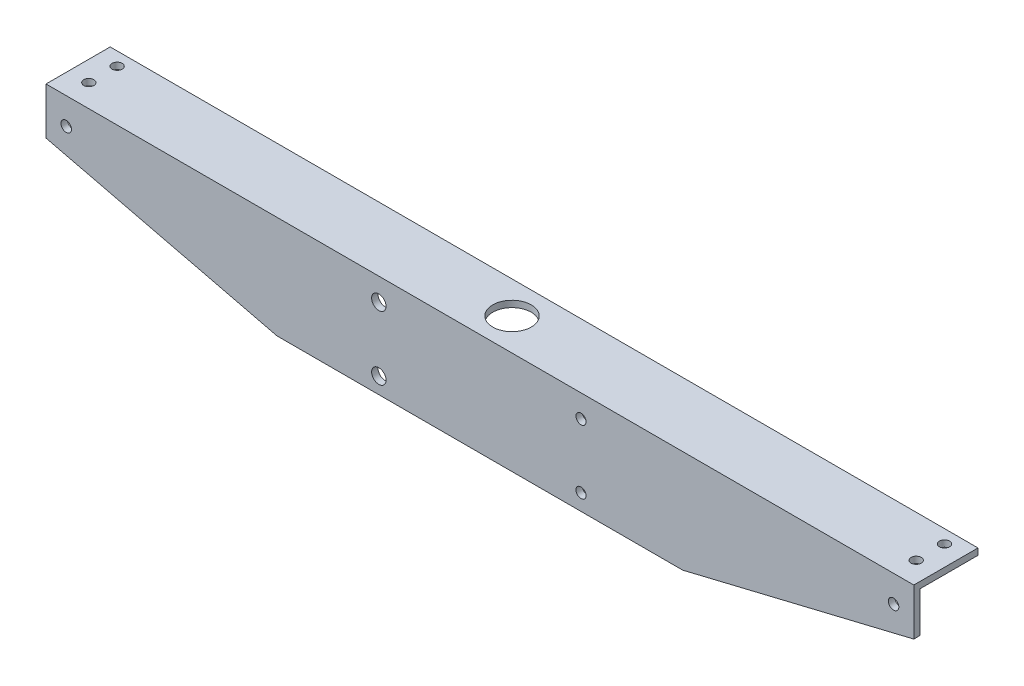
ISO-10303-21;
HEADER;
FILE_DESCRIPTION(('STEP AP214'),'2;1');
FILE_NAME('part.step','',(''),(''),'','','');
FILE_SCHEMA(('AUTOMOTIVE_DESIGN { 1 0 10303 214 1 1 1 1 }'));
ENDSEC;
DATA;
#1=APPLICATION_CONTEXT('core data for automotive mechanical design processes');
#2=APPLICATION_PROTOCOL_DEFINITION('international standard','automotive_design',2000,#1);
#3=PRODUCT_CONTEXT('',#1,'mechanical');
#4=PRODUCT('Part','Part','',(#3));
#5=PRODUCT_RELATED_PRODUCT_CATEGORY('part','',(#4));
#6=PRODUCT_DEFINITION_FORMATION('','',#4);
#7=PRODUCT_DEFINITION_CONTEXT('part definition',#1,'design');
#8=PRODUCT_DEFINITION('design','',#6,#7);
#9=PRODUCT_DEFINITION_SHAPE('','',#8);
#10=(LENGTH_UNIT() NAMED_UNIT(*) SI_UNIT(.MILLI.,.METRE.));
#11=(NAMED_UNIT(*) PLANE_ANGLE_UNIT() SI_UNIT($,.RADIAN.));
#12=(NAMED_UNIT(*) SI_UNIT($,.STERADIAN.) SOLID_ANGLE_UNIT());
#13=UNCERTAINTY_MEASURE_WITH_UNIT(LENGTH_MEASURE(1.E-05),#10,'distance_accuracy_value','');
#14=(GEOMETRIC_REPRESENTATION_CONTEXT(3) GLOBAL_UNCERTAINTY_ASSIGNED_CONTEXT((#13)) GLOBAL_UNIT_ASSIGNED_CONTEXT((#10,
#11,#12)) REPRESENTATION_CONTEXT('',''));
#15=CARTESIAN_POINT('',(0.,0.,0.));
#16=DIRECTION('',(0.,0.,1.));
#17=DIRECTION('',(1.,0.,0.));
#18=AXIS2_PLACEMENT_3D('',#15,#16,#17);
#19=CARTESIAN_POINT('',(214.63,-50.8,0.));
#20=DIRECTION('',(0.,0.,-1.));
#21=DIRECTION('',(-1.,0.,0.));
#22=AXIS2_PLACEMENT_3D('',#19,#20,#21);
#23=PLANE('',#22);
#24=CARTESIAN_POINT('',(-204.63,-13.1750000660001,0.));
#25=DIRECTION('',(0.,0.,1.));
#26=DIRECTION('',(-1.,0.,0.));
#27=AXIS2_PLACEMENT_3D('',#24,#25,#26);
#28=CIRCLE('',#27,2.59999999999999);
#29=CARTESIAN_POINT('',(-207.23,-13.1750000660001,0.));
#30=VERTEX_POINT('',#29);
#31=EDGE_CURVE('E210',#30,#30,#28,.T.);
#32=ORIENTED_EDGE('',*,*,#31,.F.);
#33=EDGE_LOOP('',(#32));
#34=FACE_BOUND('',#33,.T.);
#35=CARTESIAN_POINT('',(204.63,-13.175000066,0.));
#36=DIRECTION('',(0.,0.,1.));
#37=DIRECTION('',(1.,0.,0.));
#38=AXIS2_PLACEMENT_3D('',#35,#36,#37);
#39=CIRCLE('',#38,2.59999999999999);
#40=CARTESIAN_POINT('',(207.23,-13.175000066,0.));
#41=VERTEX_POINT('',#40);
#42=EDGE_CURVE('E214',#41,#41,#39,.T.);
#43=ORIENTED_EDGE('',*,*,#42,.F.);
#44=EDGE_LOOP('',(#43));
#45=FACE_BOUND('',#44,.T.);
#46=CARTESIAN_POINT('',(50.,-42.8,0.));
#47=DIRECTION('',(0.,0.,-1.));
#48=DIRECTION('',(0.,1.,0.));
#49=AXIS2_PLACEMENT_3D('',#46,#47,#48);
#50=CIRCLE('',#49,2.5);
#51=CARTESIAN_POINT('',(50.,-40.3,0.));
#52=VERTEX_POINT('',#51);
#53=EDGE_CURVE('E164',#52,#52,#50,.T.);
#54=ORIENTED_EDGE('',*,*,#53,.T.);
#55=EDGE_LOOP('',(#54));
#56=FACE_BOUND('',#55,.T.);
#57=CARTESIAN_POINT('',(-50.,-42.8,0.));
#58=DIRECTION('',(0.,0.,-1.));
#59=DIRECTION('',(0.,1.,0.));
#60=AXIS2_PLACEMENT_3D('',#57,#58,#59);
#61=CIRCLE('',#60,3.57);
#62=CARTESIAN_POINT('',(-50.,-39.23,0.));
#63=VERTEX_POINT('',#62);
#64=EDGE_CURVE('E172',#63,#63,#61,.T.);
#65=ORIENTED_EDGE('',*,*,#64,.T.);
#66=EDGE_LOOP('',(#65));
#67=FACE_BOUND('',#66,.T.);
#68=CARTESIAN_POINT('',(-50.,-11.175,0.));
#69=DIRECTION('',(0.,0.,-1.));
#70=DIRECTION('',(0.,1.,0.));
#71=AXIS2_PLACEMENT_3D('',#68,#69,#70);
#72=CIRCLE('',#71,3.57);
#73=CARTESIAN_POINT('',(-50.,-7.60500000000001,0.));
#74=VERTEX_POINT('',#73);
#75=EDGE_CURVE('E178',#74,#74,#72,.T.);
#76=ORIENTED_EDGE('',*,*,#75,.T.);
#77=EDGE_LOOP('',(#76));
#78=FACE_BOUND('',#77,.T.);
#79=CARTESIAN_POINT('',(50.,-11.175,0.));
#80=DIRECTION('',(0.,0.,-1.));
#81=DIRECTION('',(0.,1.,0.));
#82=AXIS2_PLACEMENT_3D('',#79,#80,#81);
#83=CIRCLE('',#82,2.5);
#84=CARTESIAN_POINT('',(50.,-8.675,0.));
#85=VERTEX_POINT('',#84);
#86=EDGE_CURVE('E133',#85,#85,#83,.T.);
#87=ORIENTED_EDGE('',*,*,#86,.T.);
#88=EDGE_LOOP('',(#87));
#89=FACE_BOUND('',#88,.T.);
#90=DIRECTION('',(-1.,0.,0.));
#91=VECTOR('',#90,1.);
#92=CARTESIAN_POINT('',(214.63,-50.8,0.));
#93=LINE('',#92,#91);
#94=CARTESIAN_POINT('',(100.33,-50.8,0.));
#95=VERTEX_POINT('',#94);
#96=CARTESIAN_POINT('',(-100.33,-50.8,0.));
#97=VERTEX_POINT('',#96);
#98=EDGE_CURVE('E11',#95,#97,#93,.T.);
#99=ORIENTED_EDGE('',*,*,#98,.F.);
#100=DIRECTION('',(0.972013609099375,0.234924549005864,0.));
#101=VECTOR('',#100,1.);
#102=CARTESIAN_POINT('',(100.33,-50.8,0.));
#103=LINE('',#102,#101);
#104=CARTESIAN_POINT('',(214.63,-23.1750000000001,0.));
#105=VERTEX_POINT('',#104);
#106=EDGE_CURVE('E96',#95,#105,#103,.T.);
#107=ORIENTED_EDGE('',*,*,#106,.T.);
#108=DIRECTION('',(0.,-1.,0.));
#109=VECTOR('',#108,1.);
#110=CARTESIAN_POINT('',(214.63,-50.8,0.));
#111=LINE('',#110,#109);
#112=CARTESIAN_POINT('',(214.63,0.,0.));
#113=VERTEX_POINT('',#112);
#114=EDGE_CURVE('E107',#113,#105,#111,.T.);
#115=ORIENTED_EDGE('',*,*,#114,.F.);
#116=DIRECTION('',(-1.,0.,0.));
#117=VECTOR('',#116,1.);
#118=CARTESIAN_POINT('',(214.63,0.,0.));
#119=LINE('',#118,#117);
#120=CARTESIAN_POINT('',(-214.63,0.,0.));
#121=VERTEX_POINT('',#120);
#122=EDGE_CURVE('E128',#113,#121,#119,.T.);
#123=ORIENTED_EDGE('',*,*,#122,.T.);
#124=DIRECTION('',(0.,-1.,0.));
#125=VECTOR('',#124,1.);
#126=CARTESIAN_POINT('',(-214.63,-50.8,0.));
#127=LINE('',#126,#125);
#128=CARTESIAN_POINT('',(-214.63,-23.175,0.));
#129=VERTEX_POINT('',#128);
#130=EDGE_CURVE('E129',#121,#129,#127,.T.);
#131=ORIENTED_EDGE('',*,*,#130,.T.);
#132=DIRECTION('',(0.972013609099375,-0.234924549005864,0.));
#133=VECTOR('',#132,1.);
#134=CARTESIAN_POINT('',(-100.33,-50.8,0.));
#135=LINE('',#134,#133);
#136=EDGE_CURVE('E54',#129,#97,#135,.T.);
#137=ORIENTED_EDGE('',*,*,#136,.T.);
#138=EDGE_LOOP('',(#99,#107,#115,#123,#131,#137));
#139=FACE_BOUND('',#138,.T.);
#140=ADVANCED_FACE('F32',(#34,#45,#56,#67,#78,#89,#139),#23,.F.);
#141=CARTESIAN_POINT('',(214.63,-50.8,-3.175));
#142=DIRECTION('',(0.,1.,0.));
#143=DIRECTION('',(0.,0.,1.));
#144=AXIS2_PLACEMENT_3D('',#141,#142,#143);
#145=PLANE('',#144);
#146=DIRECTION('',(-1.,0.,0.));
#147=VECTOR('',#146,1.);
#148=CARTESIAN_POINT('',(214.63,-50.8,-3.175));
#149=LINE('',#148,#147);
#150=CARTESIAN_POINT('',(100.33,-50.8,-3.175));
#151=VERTEX_POINT('',#150);
#152=CARTESIAN_POINT('',(-100.33,-50.8,-3.175));
#153=VERTEX_POINT('',#152);
#154=EDGE_CURVE('E39',#151,#153,#149,.T.);
#155=ORIENTED_EDGE('',*,*,#154,.F.);
#156=DIRECTION('',(0.,0.,-1.));
#157=VECTOR('',#156,1.);
#158=CARTESIAN_POINT('',(100.33,-50.8,0.));
#159=LINE('',#158,#157);
#160=EDGE_CURVE('E101',#95,#151,#159,.T.);
#161=ORIENTED_EDGE('',*,*,#160,.F.);
#162=ORIENTED_EDGE('',*,*,#98,.T.);
#163=DIRECTION('',(0.,0.,-1.));
#164=VECTOR('',#163,1.);
#165=CARTESIAN_POINT('',(-100.33,-50.8,0.));
#166=LINE('',#165,#164);
#167=EDGE_CURVE('E157',#97,#153,#166,.T.);
#168=ORIENTED_EDGE('',*,*,#167,.T.);
#169=EDGE_LOOP('',(#155,#161,#162,#168));
#170=FACE_BOUND('',#169,.T.);
#171=ADVANCED_FACE('F160',(#170),#145,.F.);
#172=CARTESIAN_POINT('',(214.63,-3.175,-3.17499999999999));
#173=DIRECTION('',(0.,0.,1.));
#174=DIRECTION('',(0.,-1.,0.));
#175=AXIS2_PLACEMENT_3D('',#172,#173,#174);
#176=PLANE('',#175);
#177=CARTESIAN_POINT('',(-204.63,-13.1750000660001,-3.17499999999999));
#178=DIRECTION('',(0.,0.,1.));
#179=DIRECTION('',(0.,-1.,0.));
#180=AXIS2_PLACEMENT_3D('',#177,#178,#179);
#181=CIRCLE('',#180,2.59999999999999);
#182=CARTESIAN_POINT('',(-204.63,-15.775000066,-3.17499999999999));
#183=VERTEX_POINT('',#182);
#184=EDGE_CURVE('E298',#183,#183,#181,.F.);
#185=ORIENTED_EDGE('',*,*,#184,.F.);
#186=EDGE_LOOP('',(#185));
#187=FACE_BOUND('',#186,.T.);
#188=CARTESIAN_POINT('',(204.63,-13.175000066,-3.17499999999999));
#189=DIRECTION('',(0.,0.,1.));
#190=DIRECTION('',(0.,-1.,0.));
#191=AXIS2_PLACEMENT_3D('',#188,#189,#190);
#192=CIRCLE('',#191,2.59999999999999);
#193=CARTESIAN_POINT('',(204.63,-15.775000066,-3.17499999999999));
#194=VERTEX_POINT('',#193);
#195=EDGE_CURVE('E294',#194,#194,#192,.F.);
#196=ORIENTED_EDGE('',*,*,#195,.F.);
#197=EDGE_LOOP('',(#196));
#198=FACE_BOUND('',#197,.T.);
#199=CARTESIAN_POINT('',(50.,-42.8,-3.175));
#200=DIRECTION('',(0.,0.,-1.));
#201=DIRECTION('',(0.,1.,0.));
#202=AXIS2_PLACEMENT_3D('',#199,#200,#201);
#203=CIRCLE('',#202,2.5);
#204=CARTESIAN_POINT('',(50.,-40.3,-3.175));
#205=VERTEX_POINT('',#204);
#206=EDGE_CURVE('E161',#205,#205,#203,.T.);
#207=ORIENTED_EDGE('',*,*,#206,.F.);
#208=EDGE_LOOP('',(#207));
#209=FACE_BOUND('',#208,.T.);
#210=CARTESIAN_POINT('',(-50.,-42.8,-3.175));
#211=DIRECTION('',(0.,0.,-1.));
#212=DIRECTION('',(0.,1.,0.));
#213=AXIS2_PLACEMENT_3D('',#210,#211,#212);
#214=CIRCLE('',#213,3.57);
#215=CARTESIAN_POINT('',(-50.,-39.23,-3.175));
#216=VERTEX_POINT('',#215);
#217=EDGE_CURVE('E170',#216,#216,#214,.T.);
#218=ORIENTED_EDGE('',*,*,#217,.F.);
#219=EDGE_LOOP('',(#218));
#220=FACE_BOUND('',#219,.T.);
#221=CARTESIAN_POINT('',(-50.,-11.175,-3.17499999999999));
#222=DIRECTION('',(0.,0.,-1.));
#223=DIRECTION('',(0.,1.,0.));
#224=AXIS2_PLACEMENT_3D('',#221,#222,#223);
#225=CIRCLE('',#224,3.57);
#226=CARTESIAN_POINT('',(-50.,-7.60500000000001,-3.17499999999999));
#227=VERTEX_POINT('',#226);
#228=EDGE_CURVE('E175',#227,#227,#225,.T.);
#229=ORIENTED_EDGE('',*,*,#228,.F.);
#230=EDGE_LOOP('',(#229));
#231=FACE_BOUND('',#230,.T.);
#232=CARTESIAN_POINT('',(50.,-11.175,-3.17499999999999));
#233=DIRECTION('',(0.,0.,-1.));
#234=DIRECTION('',(0.,1.,0.));
#235=AXIS2_PLACEMENT_3D('',#232,#233,#234);
#236=CIRCLE('',#235,2.5);
#237=CARTESIAN_POINT('',(50.,-8.675,-3.17499999999999));
#238=VERTEX_POINT('',#237);
#239=EDGE_CURVE('E121',#238,#238,#236,.T.);
#240=ORIENTED_EDGE('',*,*,#239,.F.);
#241=EDGE_LOOP('',(#240));
#242=FACE_BOUND('',#241,.T.);
#243=DIRECTION('',(0.,1.,0.));
#244=VECTOR('',#243,1.);
#245=CARTESIAN_POINT('',(214.63,-3.175,-3.17499999999999));
#246=LINE('',#245,#244);
#247=CARTESIAN_POINT('',(214.63,-23.1750000000001,-3.175));
#248=VERTEX_POINT('',#247);
#249=CARTESIAN_POINT('',(214.63,-3.175,-3.17499999999999));
#250=VERTEX_POINT('',#249);
#251=EDGE_CURVE('E113',#248,#250,#246,.T.);
#252=ORIENTED_EDGE('',*,*,#251,.F.);
#253=DIRECTION('',(0.972013609099375,0.234924549005864,0.));
#254=VECTOR('',#253,1.);
#255=CARTESIAN_POINT('',(100.33,-50.8,-3.175));
#256=LINE('',#255,#254);
#257=EDGE_CURVE('E46',#151,#248,#256,.T.);
#258=ORIENTED_EDGE('',*,*,#257,.F.);
#259=ORIENTED_EDGE('',*,*,#154,.T.);
#260=DIRECTION('',(0.972013609099375,-0.234924549005864,0.));
#261=VECTOR('',#260,1.);
#262=CARTESIAN_POINT('',(-100.33,-50.8,-3.175));
#263=LINE('',#262,#261);
#264=CARTESIAN_POINT('',(-214.63,-23.175,-3.17499999999999));
#265=VERTEX_POINT('',#264);
#266=EDGE_CURVE('E152',#265,#153,#263,.T.);
#267=ORIENTED_EDGE('',*,*,#266,.F.);
#268=DIRECTION('',(0.,1.,0.));
#269=VECTOR('',#268,1.);
#270=CARTESIAN_POINT('',(-214.63,-3.175,-3.17499999999999));
#271=LINE('',#270,#269);
#272=CARTESIAN_POINT('',(-214.63,-3.175,-3.17499999999999));
#273=VERTEX_POINT('',#272);
#274=EDGE_CURVE('E132',#265,#273,#271,.T.);
#275=ORIENTED_EDGE('',*,*,#274,.T.);
#276=DIRECTION('',(-1.,0.,0.));
#277=VECTOR('',#276,1.);
#278=CARTESIAN_POINT('',(214.63,-3.175,-3.17499999999999));
#279=LINE('',#278,#277);
#280=EDGE_CURVE('E145',#250,#273,#279,.T.);
#281=ORIENTED_EDGE('',*,*,#280,.F.);
#282=EDGE_LOOP('',(#252,#258,#259,#267,#275,#281));
#283=FACE_BOUND('',#282,.T.);
#284=ADVANCED_FACE('F151',(#187,#198,#209,#220,#231,#242,#283),#176,.F.);
#285=CARTESIAN_POINT('',(214.63,-3.175,-31.75));
#286=DIRECTION('',(0.,1.,0.));
#287=DIRECTION('',(0.,0.,1.));
#288=AXIS2_PLACEMENT_3D('',#285,#286,#287);
#289=PLANE('',#288);
#290=CARTESIAN_POINT('',(0.,-3.175,-15.875));
#291=DIRECTION('',(0.,-1.,0.));
#292=DIRECTION('',(0.,0.,-1.));
#293=AXIS2_PLACEMENT_3D('',#290,#291,#292);
#294=CIRCLE('',#293,9.525);
#295=CARTESIAN_POINT('',(0.,-3.175,-25.4));
#296=VERTEX_POINT('',#295);
#297=EDGE_CURVE('E291',#296,#296,#294,.T.);
#298=ORIENTED_EDGE('',*,*,#297,.F.);
#299=EDGE_LOOP('',(#298));
#300=FACE_BOUND('',#299,.T.);
#301=CARTESIAN_POINT('',(204.63,-3.175,-11.176));
#302=DIRECTION('',(0.,1.,0.));
#303=DIRECTION('',(0.,0.,-1.));
#304=AXIS2_PLACEMENT_3D('',#301,#302,#303);
#305=CIRCLE('',#304,2.5);
#306=CARTESIAN_POINT('',(204.63,-3.175,-13.676));
#307=VERTEX_POINT('',#306);
#308=EDGE_CURVE('E280',#307,#307,#305,.T.);
#309=ORIENTED_EDGE('',*,*,#308,.T.);
#310=EDGE_LOOP('',(#309));
#311=FACE_BOUND('',#310,.T.);
#312=CARTESIAN_POINT('',(204.63,-3.175,-25.176));
#313=DIRECTION('',(0.,1.,0.));
#314=DIRECTION('',(0.,0.,-1.));
#315=AXIS2_PLACEMENT_3D('',#312,#313,#314);
#316=CIRCLE('',#315,2.5);
#317=CARTESIAN_POINT('',(204.63,-3.175,-27.676));
#318=VERTEX_POINT('',#317);
#319=EDGE_CURVE('E274',#318,#318,#316,.T.);
#320=ORIENTED_EDGE('',*,*,#319,.T.);
#321=EDGE_LOOP('',(#320));
#322=FACE_BOUND('',#321,.T.);
#323=CARTESIAN_POINT('',(-204.63,-3.175,-25.176));
#324=DIRECTION('',(0.,1.,0.));
#325=DIRECTION('',(0.,0.,1.));
#326=AXIS2_PLACEMENT_3D('',#323,#324,#325);
#327=CIRCLE('',#326,2.5);
#328=CARTESIAN_POINT('',(-204.63,-3.175,-22.676));
#329=VERTEX_POINT('',#328);
#330=EDGE_CURVE('E268',#329,#329,#327,.T.);
#331=ORIENTED_EDGE('',*,*,#330,.T.);
#332=EDGE_LOOP('',(#331));
#333=FACE_BOUND('',#332,.T.);
#334=CARTESIAN_POINT('',(-204.63,-3.175,-11.176));
#335=DIRECTION('',(0.,1.,0.));
#336=DIRECTION('',(0.,0.,1.));
#337=AXIS2_PLACEMENT_3D('',#334,#335,#336);
#338=CIRCLE('',#337,2.5);
#339=CARTESIAN_POINT('',(-204.63,-3.175,-8.67600000000001));
#340=VERTEX_POINT('',#339);
#341=EDGE_CURVE('E263',#340,#340,#338,.T.);
#342=ORIENTED_EDGE('',*,*,#341,.T.);
#343=EDGE_LOOP('',(#342));
#344=FACE_BOUND('',#343,.T.);
#345=DIRECTION('',(0.,0.,-1.));
#346=VECTOR('',#345,1.);
#347=CARTESIAN_POINT('',(-214.63,-3.175,-31.75));
#348=LINE('',#347,#346);
#349=CARTESIAN_POINT('',(-214.63,-3.175,-31.75));
#350=VERTEX_POINT('',#349);
#351=EDGE_CURVE('E135',#273,#350,#348,.T.);
#352=ORIENTED_EDGE('',*,*,#351,.T.);
#353=DIRECTION('',(-1.,0.,0.));
#354=VECTOR('',#353,1.);
#355=CARTESIAN_POINT('',(214.63,-3.175,-31.75));
#356=LINE('',#355,#354);
#357=CARTESIAN_POINT('',(214.63,-3.175,-31.75));
#358=VERTEX_POINT('',#357);
#359=EDGE_CURVE('E142',#358,#350,#356,.T.);
#360=ORIENTED_EDGE('',*,*,#359,.F.);
#361=DIRECTION('',(0.,0.,-1.));
#362=VECTOR('',#361,1.);
#363=CARTESIAN_POINT('',(214.63,-3.175,-31.75));
#364=LINE('',#363,#362);
#365=EDGE_CURVE('E116',#250,#358,#364,.T.);
#366=ORIENTED_EDGE('',*,*,#365,.F.);
#367=ORIENTED_EDGE('',*,*,#280,.T.);
#368=EDGE_LOOP('',(#352,#360,#366,#367));
#369=FACE_BOUND('',#368,.T.);
#370=ADVANCED_FACE('F191',(#300,#311,#322,#333,#344,#369),#289,.F.);
#371=CARTESIAN_POINT('',(214.63,0.,-31.75));
#372=DIRECTION('',(0.,0.,1.));
#373=DIRECTION('',(1.,0.,0.));
#374=AXIS2_PLACEMENT_3D('',#371,#372,#373);
#375=PLANE('',#374);
#376=DIRECTION('',(0.,1.,0.));
#377=VECTOR('',#376,1.);
#378=CARTESIAN_POINT('',(-214.63,0.,-31.75));
#379=LINE('',#378,#377);
#380=CARTESIAN_POINT('',(-214.63,0.,-31.75));
#381=VERTEX_POINT('',#380);
#382=EDGE_CURVE('E118',#350,#381,#379,.T.);
#383=ORIENTED_EDGE('',*,*,#382,.T.);
#384=DIRECTION('',(-1.,0.,0.));
#385=VECTOR('',#384,1.);
#386=CARTESIAN_POINT('',(214.63,0.,-31.75));
#387=LINE('',#386,#385);
#388=CARTESIAN_POINT('',(214.63,0.,-31.75));
#389=VERTEX_POINT('',#388);
#390=EDGE_CURVE('E139',#389,#381,#387,.T.);
#391=ORIENTED_EDGE('',*,*,#390,.F.);
#392=DIRECTION('',(0.,1.,0.));
#393=VECTOR('',#392,1.);
#394=CARTESIAN_POINT('',(214.63,0.,-31.75));
#395=LINE('',#394,#393);
#396=EDGE_CURVE('E125',#358,#389,#395,.T.);
#397=ORIENTED_EDGE('',*,*,#396,.F.);
#398=ORIENTED_EDGE('',*,*,#359,.T.);
#399=EDGE_LOOP('',(#383,#391,#397,#398));
#400=FACE_BOUND('',#399,.T.);
#401=ADVANCED_FACE('F198',(#400),#375,.F.);
#402=CARTESIAN_POINT('',(214.63,0.,0.));
#403=DIRECTION('',(0.,-1.,0.));
#404=DIRECTION('',(0.,0.,-1.));
#405=AXIS2_PLACEMENT_3D('',#402,#403,#404);
#406=PLANE('',#405);
#407=CARTESIAN_POINT('',(0.,0.,-15.875));
#408=DIRECTION('',(0.,-1.,0.));
#409=DIRECTION('',(0.,0.,-1.));
#410=AXIS2_PLACEMENT_3D('',#407,#408,#409);
#411=CIRCLE('',#410,9.525);
#412=CARTESIAN_POINT('',(0.,0.,-25.4));
#413=VERTEX_POINT('',#412);
#414=EDGE_CURVE('E286',#413,#413,#411,.F.);
#415=ORIENTED_EDGE('',*,*,#414,.F.);
#416=EDGE_LOOP('',(#415));
#417=FACE_BOUND('',#416,.T.);
#418=CARTESIAN_POINT('',(204.63,0.,-11.176));
#419=DIRECTION('',(0.,1.,0.));
#420=DIRECTION('',(0.,0.,-1.));
#421=AXIS2_PLACEMENT_3D('',#418,#419,#420);
#422=CIRCLE('',#421,2.5);
#423=CARTESIAN_POINT('',(204.63,0.,-13.676));
#424=VERTEX_POINT('',#423);
#425=EDGE_CURVE('E283',#424,#424,#422,.T.);
#426=ORIENTED_EDGE('',*,*,#425,.F.);
#427=EDGE_LOOP('',(#426));
#428=FACE_BOUND('',#427,.T.);
#429=CARTESIAN_POINT('',(204.63,0.,-25.176));
#430=DIRECTION('',(0.,1.,0.));
#431=DIRECTION('',(0.,0.,-1.));
#432=AXIS2_PLACEMENT_3D('',#429,#430,#431);
#433=CIRCLE('',#432,2.5);
#434=CARTESIAN_POINT('',(204.63,0.,-27.676));
#435=VERTEX_POINT('',#434);
#436=EDGE_CURVE('E277',#435,#435,#433,.T.);
#437=ORIENTED_EDGE('',*,*,#436,.F.);
#438=EDGE_LOOP('',(#437));
#439=FACE_BOUND('',#438,.T.);
#440=CARTESIAN_POINT('',(-204.63,0.,-25.176));
#441=DIRECTION('',(0.,1.,0.));
#442=DIRECTION('',(0.,0.,1.));
#443=AXIS2_PLACEMENT_3D('',#440,#441,#442);
#444=CIRCLE('',#443,2.5);
#445=CARTESIAN_POINT('',(-204.63,0.,-22.676));
#446=VERTEX_POINT('',#445);
#447=EDGE_CURVE('E271',#446,#446,#444,.T.);
#448=ORIENTED_EDGE('',*,*,#447,.F.);
#449=EDGE_LOOP('',(#448));
#450=FACE_BOUND('',#449,.T.);
#451=CARTESIAN_POINT('',(-204.63,0.,-11.176));
#452=DIRECTION('',(0.,1.,0.));
#453=DIRECTION('',(0.,0.,1.));
#454=AXIS2_PLACEMENT_3D('',#451,#452,#453);
#455=CIRCLE('',#454,2.5);
#456=CARTESIAN_POINT('',(-204.63,0.,-8.67600000000001));
#457=VERTEX_POINT('',#456);
#458=EDGE_CURVE('E265',#457,#457,#455,.T.);
#459=ORIENTED_EDGE('',*,*,#458,.F.);
#460=EDGE_LOOP('',(#459));
#461=FACE_BOUND('',#460,.T.);
#462=DIRECTION('',(0.,0.,1.));
#463=VECTOR('',#462,1.);
#464=CARTESIAN_POINT('',(-214.63,0.,0.));
#465=LINE('',#464,#463);
#466=EDGE_CURVE('E114',#381,#121,#465,.T.);
#467=ORIENTED_EDGE('',*,*,#466,.T.);
#468=ORIENTED_EDGE('',*,*,#122,.F.);
#469=DIRECTION('',(0.,0.,1.));
#470=VECTOR('',#469,1.);
#471=CARTESIAN_POINT('',(214.63,0.,0.));
#472=LINE('',#471,#470);
#473=EDGE_CURVE('E111',#389,#113,#472,.T.);
#474=ORIENTED_EDGE('',*,*,#473,.F.);
#475=ORIENTED_EDGE('',*,*,#390,.T.);
#476=EDGE_LOOP('',(#467,#468,#474,#475));
#477=FACE_BOUND('',#476,.T.);
#478=ADVANCED_FACE('F242',(#417,#428,#439,#450,#461,#477),#406,.F.);
#479=CARTESIAN_POINT('',(214.63,0.,0.));
#480=DIRECTION('',(-1.,0.,0.));
#481=DIRECTION('',(0.,0.,1.));
#482=AXIS2_PLACEMENT_3D('',#479,#480,#481);
#483=PLANE('',#482);
#484=ORIENTED_EDGE('',*,*,#114,.T.);
#485=DIRECTION('',(0.,0.,-1.));
#486=VECTOR('',#485,1.);
#487=CARTESIAN_POINT('',(214.63,-23.1750000000001,0.));
#488=LINE('',#487,#486);
#489=EDGE_CURVE('E93',#105,#248,#488,.T.);
#490=ORIENTED_EDGE('',*,*,#489,.T.);
#491=ORIENTED_EDGE('',*,*,#251,.T.);
#492=ORIENTED_EDGE('',*,*,#365,.T.);
#493=ORIENTED_EDGE('',*,*,#396,.T.);
#494=ORIENTED_EDGE('',*,*,#473,.T.);
#495=EDGE_LOOP('',(#484,#490,#491,#492,#493,#494));
#496=FACE_BOUND('',#495,.T.);
#497=ADVANCED_FACE('F109',(#496),#483,.F.);
#498=CARTESIAN_POINT('',(-214.63,0.,0.));
#499=DIRECTION('',(-1.,0.,0.));
#500=DIRECTION('',(0.,0.,1.));
#501=AXIS2_PLACEMENT_3D('',#498,#499,#500);
#502=PLANE('',#501);
#503=DIRECTION('',(0.,0.,-1.));
#504=VECTOR('',#503,1.);
#505=CARTESIAN_POINT('',(-214.63,-23.175,0.));
#506=LINE('',#505,#504);
#507=EDGE_CURVE('E158',#129,#265,#506,.T.);
#508=ORIENTED_EDGE('',*,*,#507,.F.);
#509=ORIENTED_EDGE('',*,*,#130,.F.);
#510=ORIENTED_EDGE('',*,*,#466,.F.);
#511=ORIENTED_EDGE('',*,*,#382,.F.);
#512=ORIENTED_EDGE('',*,*,#351,.F.);
#513=ORIENTED_EDGE('',*,*,#274,.F.);
#514=EDGE_LOOP('',(#508,#509,#510,#511,#512,#513));
#515=FACE_BOUND('',#514,.T.);
#516=ADVANCED_FACE('F235',(#515),#502,.T.);
#517=CARTESIAN_POINT('',(50.,-11.175,0.));
#518=DIRECTION('',(0.,0.,-1.));
#519=DIRECTION('',(0.,1.,0.));
#520=AXIS2_PLACEMENT_3D('',#517,#518,#519);
#521=CYLINDRICAL_SURFACE('',#520,2.5);
#522=ORIENTED_EDGE('',*,*,#86,.F.);
#523=EDGE_LOOP('',(#522));
#524=FACE_BOUND('',#523,.T.);
#525=ORIENTED_EDGE('',*,*,#239,.T.);
#526=EDGE_LOOP('',(#525));
#527=FACE_BOUND('',#526,.T.);
#528=ADVANCED_FACE('F188',(#524,#527),#521,.F.);
#529=CARTESIAN_POINT('',(-50.,-11.175,0.));
#530=DIRECTION('',(0.,0.,-1.));
#531=DIRECTION('',(0.,1.,0.));
#532=AXIS2_PLACEMENT_3D('',#529,#530,#531);
#533=CYLINDRICAL_SURFACE('',#532,3.57);
#534=ORIENTED_EDGE('',*,*,#75,.F.);
#535=EDGE_LOOP('',(#534));
#536=FACE_BOUND('',#535,.T.);
#537=ORIENTED_EDGE('',*,*,#228,.T.);
#538=EDGE_LOOP('',(#537));
#539=FACE_BOUND('',#538,.T.);
#540=ADVANCED_FACE('F221',(#536,#539),#533,.F.);
#541=CARTESIAN_POINT('',(-50.,-42.8,0.));
#542=DIRECTION('',(0.,0.,-1.));
#543=DIRECTION('',(0.,1.,0.));
#544=AXIS2_PLACEMENT_3D('',#541,#542,#543);
#545=CYLINDRICAL_SURFACE('',#544,3.57);
#546=ORIENTED_EDGE('',*,*,#64,.F.);
#547=EDGE_LOOP('',(#546));
#548=FACE_BOUND('',#547,.T.);
#549=ORIENTED_EDGE('',*,*,#217,.T.);
#550=EDGE_LOOP('',(#549));
#551=FACE_BOUND('',#550,.T.);
#552=ADVANCED_FACE('F224',(#548,#551),#545,.F.);
#553=CARTESIAN_POINT('',(50.,-42.8,0.));
#554=DIRECTION('',(0.,0.,-1.));
#555=DIRECTION('',(0.,1.,0.));
#556=AXIS2_PLACEMENT_3D('',#553,#554,#555);
#557=CYLINDRICAL_SURFACE('',#556,2.5);
#558=ORIENTED_EDGE('',*,*,#53,.F.);
#559=EDGE_LOOP('',(#558));
#560=FACE_BOUND('',#559,.T.);
#561=ORIENTED_EDGE('',*,*,#206,.T.);
#562=EDGE_LOOP('',(#561));
#563=FACE_BOUND('',#562,.T.);
#564=ADVANCED_FACE('F232',(#560,#563),#557,.F.);
#565=CARTESIAN_POINT('',(-100.33,-50.8,0.));
#566=DIRECTION('',(0.234924549005864,0.972013609099374,0.));
#567=DIRECTION('',(-0.972013609099375,0.234924549005864,0.));
#568=AXIS2_PLACEMENT_3D('',#565,#566,#567);
#569=PLANE('',#568);
#570=ORIENTED_EDGE('',*,*,#266,.T.);
#571=ORIENTED_EDGE('',*,*,#167,.F.);
#572=ORIENTED_EDGE('',*,*,#136,.F.);
#573=ORIENTED_EDGE('',*,*,#507,.T.);
#574=EDGE_LOOP('',(#570,#571,#572,#573));
#575=FACE_BOUND('',#574,.T.);
#576=ADVANCED_FACE('F156',(#575),#569,.F.);
#577=CARTESIAN_POINT('',(100.33,-50.8,0.));
#578=DIRECTION('',(-0.234924549005864,0.972013609099374,0.));
#579=DIRECTION('',(-0.972013609099375,-0.234924549005864,0.));
#580=AXIS2_PLACEMENT_3D('',#577,#578,#579);
#581=PLANE('',#580);
#582=ORIENTED_EDGE('',*,*,#257,.T.);
#583=ORIENTED_EDGE('',*,*,#489,.F.);
#584=ORIENTED_EDGE('',*,*,#106,.F.);
#585=ORIENTED_EDGE('',*,*,#160,.T.);
#586=EDGE_LOOP('',(#582,#583,#584,#585));
#587=FACE_BOUND('',#586,.T.);
#588=ADVANCED_FACE('F95',(#587),#581,.F.);
#589=CARTESIAN_POINT('',(-204.63,-3.175,-11.176));
#590=DIRECTION('',(0.,1.,0.));
#591=DIRECTION('',(0.,0.,1.));
#592=AXIS2_PLACEMENT_3D('',#589,#590,#591);
#593=CYLINDRICAL_SURFACE('',#592,2.5);
#594=ORIENTED_EDGE('',*,*,#341,.F.);
#595=EDGE_LOOP('',(#594));
#596=FACE_BOUND('',#595,.T.);
#597=ORIENTED_EDGE('',*,*,#458,.T.);
#598=EDGE_LOOP('',(#597));
#599=FACE_BOUND('',#598,.T.);
#600=ADVANCED_FACE('F328',(#596,#599),#593,.F.);
#601=CARTESIAN_POINT('',(-204.63,-3.175,-25.176));
#602=DIRECTION('',(0.,1.,0.));
#603=DIRECTION('',(0.,0.,1.));
#604=AXIS2_PLACEMENT_3D('',#601,#602,#603);
#605=CYLINDRICAL_SURFACE('',#604,2.5);
#606=ORIENTED_EDGE('',*,*,#330,.F.);
#607=EDGE_LOOP('',(#606));
#608=FACE_BOUND('',#607,.T.);
#609=ORIENTED_EDGE('',*,*,#447,.T.);
#610=EDGE_LOOP('',(#609));
#611=FACE_BOUND('',#610,.T.);
#612=ADVANCED_FACE('F324',(#608,#611),#605,.F.);
#613=CARTESIAN_POINT('',(204.63,-3.175,-25.176));
#614=DIRECTION('',(0.,1.,0.));
#615=DIRECTION('',(0.,0.,1.));
#616=AXIS2_PLACEMENT_3D('',#613,#614,#615);
#617=CYLINDRICAL_SURFACE('',#616,2.5);
#618=ORIENTED_EDGE('',*,*,#319,.F.);
#619=EDGE_LOOP('',(#618));
#620=FACE_BOUND('',#619,.T.);
#621=ORIENTED_EDGE('',*,*,#436,.T.);
#622=EDGE_LOOP('',(#621));
#623=FACE_BOUND('',#622,.T.);
#624=ADVANCED_FACE('F320',(#620,#623),#617,.F.);
#625=CARTESIAN_POINT('',(204.63,-3.175,-11.176));
#626=DIRECTION('',(0.,1.,0.));
#627=DIRECTION('',(0.,0.,1.));
#628=AXIS2_PLACEMENT_3D('',#625,#626,#627);
#629=CYLINDRICAL_SURFACE('',#628,2.5);
#630=ORIENTED_EDGE('',*,*,#308,.F.);
#631=EDGE_LOOP('',(#630));
#632=FACE_BOUND('',#631,.T.);
#633=ORIENTED_EDGE('',*,*,#425,.T.);
#634=EDGE_LOOP('',(#633));
#635=FACE_BOUND('',#634,.T.);
#636=ADVANCED_FACE('F316',(#632,#635),#629,.F.);
#637=CARTESIAN_POINT('',(0.,0.00100000000000187,-15.875));
#638=DIRECTION('',(0.,-1.,0.));
#639=DIRECTION('',(0.,0.,-1.));
#640=AXIS2_PLACEMENT_3D('',#637,#638,#639);
#641=CYLINDRICAL_SURFACE('',#640,9.525);
#642=ORIENTED_EDGE('',*,*,#297,.T.);
#643=EDGE_LOOP('',(#642));
#644=FACE_BOUND('',#643,.T.);
#645=ORIENTED_EDGE('',*,*,#414,.T.);
#646=EDGE_LOOP('',(#645));
#647=FACE_BOUND('',#646,.T.);
#648=ADVANCED_FACE('F310',(#644,#647),#641,.F.);
#649=CARTESIAN_POINT('',(204.63,-13.175000066,-10.5289105243401));
#650=DIRECTION('',(0.,0.,1.));
#651=DIRECTION('',(1.,0.,0.));
#652=AXIS2_PLACEMENT_3D('',#649,#650,#651);
#653=CYLINDRICAL_SURFACE('',#652,2.59999999999999);
#654=ORIENTED_EDGE('',*,*,#195,.T.);
#655=EDGE_LOOP('',(#654));
#656=FACE_BOUND('',#655,.T.);
#657=ORIENTED_EDGE('',*,*,#42,.T.);
#658=EDGE_LOOP('',(#657));
#659=FACE_BOUND('',#658,.T.);
#660=ADVANCED_FACE('F304',(#656,#659),#653,.F.);
#661=CARTESIAN_POINT('',(-204.63,-13.1750000660001,-10.5289105243401));
#662=DIRECTION('',(0.,0.,1.));
#663=DIRECTION('',(1.,0.,0.));
#664=AXIS2_PLACEMENT_3D('',#661,#662,#663);
#665=CYLINDRICAL_SURFACE('',#664,2.59999999999999);
#666=ORIENTED_EDGE('',*,*,#184,.T.);
#667=EDGE_LOOP('',(#666));
#668=FACE_BOUND('',#667,.T.);
#669=ORIENTED_EDGE('',*,*,#31,.T.);
#670=EDGE_LOOP('',(#669));
#671=FACE_BOUND('',#670,.T.);
#672=ADVANCED_FACE('F302',(#668,#671),#665,.F.);
#673=CLOSED_SHELL('',(#140,#171,#284,#370,#401,#478,#497,#516,#528,#540,#552,#564,#576,#588,
#600,#612,#624,#636,#648,#660,#672));
#674=MANIFOLD_SOLID_BREP('B2',#673);
#675=ADVANCED_BREP_SHAPE_REPRESENTATION('',(#18,#674),#14);
#676=SHAPE_DEFINITION_REPRESENTATION(#9,#675);
ENDSEC;
END-ISO-10303-21;
